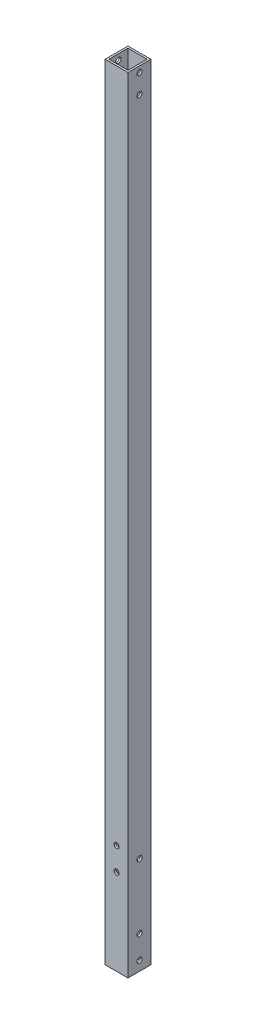
ISO-10303-21;
HEADER;
FILE_DESCRIPTION(('STEP AP214'),'2;1');
FILE_NAME('part.step','',(''),(''),'','','');
FILE_SCHEMA(('AUTOMOTIVE_DESIGN { 1 0 10303 214 1 1 1 1 }'));
ENDSEC;
DATA;
#1=APPLICATION_CONTEXT('core data for automotive mechanical design processes');
#2=APPLICATION_PROTOCOL_DEFINITION('international standard','automotive_design',2000,#1);
#3=PRODUCT_CONTEXT('',#1,'mechanical');
#4=PRODUCT('Part','Part','',(#3));
#5=PRODUCT_RELATED_PRODUCT_CATEGORY('part','',(#4));
#6=PRODUCT_DEFINITION_FORMATION('','',#4);
#7=PRODUCT_DEFINITION_CONTEXT('part definition',#1,'design');
#8=PRODUCT_DEFINITION('design','',#6,#7);
#9=PRODUCT_DEFINITION_SHAPE('','',#8);
#10=(LENGTH_UNIT() NAMED_UNIT(*) SI_UNIT(.MILLI.,.METRE.));
#11=(NAMED_UNIT(*) PLANE_ANGLE_UNIT() SI_UNIT($,.RADIAN.));
#12=(NAMED_UNIT(*) SI_UNIT($,.STERADIAN.) SOLID_ANGLE_UNIT());
#13=UNCERTAINTY_MEASURE_WITH_UNIT(LENGTH_MEASURE(1.E-05),#10,'distance_accuracy_value','');
#14=(GEOMETRIC_REPRESENTATION_CONTEXT(3) GLOBAL_UNCERTAINTY_ASSIGNED_CONTEXT((#13)) GLOBAL_UNIT_ASSIGNED_CONTEXT((#10,
#11,#12)) REPRESENTATION_CONTEXT('',''));
#15=CARTESIAN_POINT('',(0.,0.,0.));
#16=DIRECTION('',(0.,0.,1.));
#17=DIRECTION('',(1.,0.,0.));
#18=AXIS2_PLACEMENT_3D('',#15,#16,#17);
#19=CARTESIAN_POINT('',(0.,410.,0.));
#20=DIRECTION('',(0.,-1.,0.));
#21=DIRECTION('',(0.,0.,-1.));
#22=AXIS2_PLACEMENT_3D('',#19,#20,#21);
#23=PLANE('',#22);
#24=DIRECTION('',(0.,0.,-1.));
#25=VECTOR('',#24,1.);
#26=CARTESIAN_POINT('',(6.,410.,6.));
#27=LINE('',#26,#25);
#28=CARTESIAN_POINT('',(6.,410.,6.));
#29=VERTEX_POINT('',#28);
#30=CARTESIAN_POINT('',(6.,410.,-6.));
#31=VERTEX_POINT('',#30);
#32=EDGE_CURVE('E139',#29,#31,#27,.T.);
#33=ORIENTED_EDGE('',*,*,#32,.T.);
#34=DIRECTION('',(-1.,0.,0.));
#35=VECTOR('',#34,1.);
#36=CARTESIAN_POINT('',(-6.,410.,-6.));
#37=LINE('',#36,#35);
#38=CARTESIAN_POINT('',(-6.,410.,-6.));
#39=VERTEX_POINT('',#38);
#40=EDGE_CURVE('E142',#31,#39,#37,.T.);
#41=ORIENTED_EDGE('',*,*,#40,.T.);
#42=DIRECTION('',(0.,0.,1.));
#43=VECTOR('',#42,1.);
#44=CARTESIAN_POINT('',(-6.,410.,6.));
#45=LINE('',#44,#43);
#46=CARTESIAN_POINT('',(-6.,410.,6.));
#47=VERTEX_POINT('',#46);
#48=EDGE_CURVE('E145',#39,#47,#45,.T.);
#49=ORIENTED_EDGE('',*,*,#48,.T.);
#50=DIRECTION('',(1.,0.,0.));
#51=VECTOR('',#50,1.);
#52=CARTESIAN_POINT('',(-6.,410.,6.));
#53=LINE('',#52,#51);
#54=EDGE_CURVE('E147',#47,#29,#53,.T.);
#55=ORIENTED_EDGE('',*,*,#54,.T.);
#56=EDGE_LOOP('',(#33,#41,#49,#55));
#57=FACE_BOUND('',#56,.T.);
#58=DIRECTION('',(0.,0.,1.));
#59=VECTOR('',#58,1.);
#60=CARTESIAN_POINT('',(-5.,410.,5.));
#61=LINE('',#60,#59);
#62=CARTESIAN_POINT('',(-5.,410.,-5.));
#63=VERTEX_POINT('',#62);
#64=CARTESIAN_POINT('',(-5.,410.,5.));
#65=VERTEX_POINT('',#64);
#66=EDGE_CURVE('E101',#63,#65,#61,.T.);
#67=ORIENTED_EDGE('',*,*,#66,.F.);
#68=DIRECTION('',(-1.,0.,0.));
#69=VECTOR('',#68,1.);
#70=CARTESIAN_POINT('',(-5.,410.,-5.));
#71=LINE('',#70,#69);
#72=CARTESIAN_POINT('',(5.,410.,-5.));
#73=VERTEX_POINT('',#72);
#74=EDGE_CURVE('E123',#73,#63,#71,.T.);
#75=ORIENTED_EDGE('',*,*,#74,.F.);
#76=DIRECTION('',(0.,0.,-1.));
#77=VECTOR('',#76,1.);
#78=CARTESIAN_POINT('',(5.,410.,5.));
#79=LINE('',#78,#77);
#80=CARTESIAN_POINT('',(5.,410.,5.));
#81=VERTEX_POINT('',#80);
#82=EDGE_CURVE('E121',#81,#73,#79,.T.);
#83=ORIENTED_EDGE('',*,*,#82,.F.);
#84=DIRECTION('',(1.,0.,0.));
#85=VECTOR('',#84,1.);
#86=CARTESIAN_POINT('',(-5.,410.,5.));
#87=LINE('',#86,#85);
#88=EDGE_CURVE('E109',#65,#81,#87,.T.);
#89=ORIENTED_EDGE('',*,*,#88,.F.);
#90=EDGE_LOOP('',(#67,#75,#83,#89));
#91=FACE_BOUND('',#90,.T.);
#92=ADVANCED_FACE('F34',(#57,#91),#23,.F.);
#93=CARTESIAN_POINT('',(0.,0.,0.));
#94=DIRECTION('',(0.,-1.,0.));
#95=DIRECTION('',(0.,0.,-1.));
#96=AXIS2_PLACEMENT_3D('',#93,#94,#95);
#97=PLANE('',#96);
#98=DIRECTION('',(0.,0.,-1.));
#99=VECTOR('',#98,1.);
#100=CARTESIAN_POINT('',(6.,0.,6.));
#101=LINE('',#100,#99);
#102=CARTESIAN_POINT('',(6.,0.,6.));
#103=VERTEX_POINT('',#102);
#104=CARTESIAN_POINT('',(6.,0.,-6.));
#105=VERTEX_POINT('',#104);
#106=EDGE_CURVE('E117',#103,#105,#101,.T.);
#107=ORIENTED_EDGE('',*,*,#106,.F.);
#108=DIRECTION('',(1.,0.,0.));
#109=VECTOR('',#108,1.);
#110=CARTESIAN_POINT('',(-6.,0.,6.));
#111=LINE('',#110,#109);
#112=CARTESIAN_POINT('',(-6.,0.,6.));
#113=VERTEX_POINT('',#112);
#114=EDGE_CURVE('E143',#113,#103,#111,.T.);
#115=ORIENTED_EDGE('',*,*,#114,.F.);
#116=DIRECTION('',(0.,0.,1.));
#117=VECTOR('',#116,1.);
#118=CARTESIAN_POINT('',(-6.,0.,6.));
#119=LINE('',#118,#117);
#120=CARTESIAN_POINT('',(-6.,0.,-6.));
#121=VERTEX_POINT('',#120);
#122=EDGE_CURVE('E154',#121,#113,#119,.T.);
#123=ORIENTED_EDGE('',*,*,#122,.F.);
#124=DIRECTION('',(-1.,0.,0.));
#125=VECTOR('',#124,1.);
#126=CARTESIAN_POINT('',(-6.,0.,-6.));
#127=LINE('',#126,#125);
#128=EDGE_CURVE('E152',#105,#121,#127,.T.);
#129=ORIENTED_EDGE('',*,*,#128,.F.);
#130=EDGE_LOOP('',(#107,#115,#123,#129));
#131=FACE_BOUND('',#130,.T.);
#132=DIRECTION('',(-1.,0.,0.));
#133=VECTOR('',#132,1.);
#134=CARTESIAN_POINT('',(-5.,0.,-5.));
#135=LINE('',#134,#133);
#136=CARTESIAN_POINT('',(5.,0.,-5.));
#137=VERTEX_POINT('',#136);
#138=CARTESIAN_POINT('',(-5.,0.,-5.));
#139=VERTEX_POINT('',#138);
#140=EDGE_CURVE('E110',#137,#139,#135,.T.);
#141=ORIENTED_EDGE('',*,*,#140,.T.);
#142=DIRECTION('',(0.,0.,1.));
#143=VECTOR('',#142,1.);
#144=CARTESIAN_POINT('',(-5.,0.,5.));
#145=LINE('',#144,#143);
#146=CARTESIAN_POINT('',(-5.,0.,5.));
#147=VERTEX_POINT('',#146);
#148=EDGE_CURVE('E59',#139,#147,#145,.T.);
#149=ORIENTED_EDGE('',*,*,#148,.T.);
#150=DIRECTION('',(1.,0.,0.));
#151=VECTOR('',#150,1.);
#152=CARTESIAN_POINT('',(-5.,0.,5.));
#153=LINE('',#152,#151);
#154=CARTESIAN_POINT('',(5.,0.,5.));
#155=VERTEX_POINT('',#154);
#156=EDGE_CURVE('E116',#147,#155,#153,.T.);
#157=ORIENTED_EDGE('',*,*,#156,.T.);
#158=DIRECTION('',(0.,0.,-1.));
#159=VECTOR('',#158,1.);
#160=CARTESIAN_POINT('',(5.,0.,5.));
#161=LINE('',#160,#159);
#162=EDGE_CURVE('E131',#155,#137,#161,.T.);
#163=ORIENTED_EDGE('',*,*,#162,.T.);
#164=EDGE_LOOP('',(#141,#149,#157,#163));
#165=FACE_BOUND('',#164,.T.);
#166=ADVANCED_FACE('F284',(#131,#165),#97,.T.);
#167=CARTESIAN_POINT('',(6.,410.,6.));
#168=DIRECTION('',(-1.,0.,0.));
#169=DIRECTION('',(0.,0.,1.));
#170=AXIS2_PLACEMENT_3D('',#167,#168,#169);
#171=PLANE('',#170);
#172=CARTESIAN_POINT('',(6.,407.,0.));
#173=DIRECTION('',(1.,0.,0.));
#174=DIRECTION('',(0.,0.,-1.));
#175=AXIS2_PLACEMENT_3D('',#172,#173,#174);
#176=CIRCLE('',#175,1.34999999999999);
#177=CARTESIAN_POINT('',(6.,407.,-1.34999999999999));
#178=VERTEX_POINT('',#177);
#179=EDGE_CURVE('E212',#178,#178,#176,.T.);
#180=ORIENTED_EDGE('',*,*,#179,.F.);
#181=EDGE_LOOP('',(#180));
#182=FACE_BOUND('',#181,.T.);
#183=CARTESIAN_POINT('',(6.,397.,0.));
#184=DIRECTION('',(1.,0.,0.));
#185=DIRECTION('',(0.,0.,-1.));
#186=AXIS2_PLACEMENT_3D('',#183,#184,#185);
#187=CIRCLE('',#186,1.34999999999999);
#188=CARTESIAN_POINT('',(6.,397.,-1.34999999999999));
#189=VERTEX_POINT('',#188);
#190=EDGE_CURVE('E209',#189,#189,#187,.T.);
#191=ORIENTED_EDGE('',*,*,#190,.F.);
#192=EDGE_LOOP('',(#191));
#193=FACE_BOUND('',#192,.T.);
#194=CARTESIAN_POINT('',(6.,5.,0.));
#195=DIRECTION('',(1.,0.,0.));
#196=DIRECTION('',(0.,0.,-1.));
#197=AXIS2_PLACEMENT_3D('',#194,#195,#196);
#198=CIRCLE('',#197,1.35);
#199=CARTESIAN_POINT('',(6.,5.,-1.35));
#200=VERTEX_POINT('',#199);
#201=EDGE_CURVE('E227',#200,#200,#198,.T.);
#202=ORIENTED_EDGE('',*,*,#201,.F.);
#203=EDGE_LOOP('',(#202));
#204=FACE_BOUND('',#203,.T.);
#205=CARTESIAN_POINT('',(6.,17.,0.));
#206=DIRECTION('',(1.,0.,0.));
#207=DIRECTION('',(0.,0.,-1.));
#208=AXIS2_PLACEMENT_3D('',#205,#206,#207);
#209=CIRCLE('',#208,1.35);
#210=CARTESIAN_POINT('',(6.,17.,-1.35));
#211=VERTEX_POINT('',#210);
#212=EDGE_CURVE('E233',#211,#211,#209,.T.);
#213=ORIENTED_EDGE('',*,*,#212,.F.);
#214=EDGE_LOOP('',(#213));
#215=FACE_BOUND('',#214,.T.);
#216=CARTESIAN_POINT('',(6.,51.,0.));
#217=DIRECTION('',(1.,0.,0.));
#218=DIRECTION('',(0.,0.,-1.));
#219=AXIS2_PLACEMENT_3D('',#216,#217,#218);
#220=CIRCLE('',#219,1.35);
#221=CARTESIAN_POINT('',(6.,51.,-1.35));
#222=VERTEX_POINT('',#221);
#223=EDGE_CURVE('E224',#222,#222,#220,.T.);
#224=ORIENTED_EDGE('',*,*,#223,.F.);
#225=EDGE_LOOP('',(#224));
#226=FACE_BOUND('',#225,.T.);
#227=ORIENTED_EDGE('',*,*,#106,.T.);
#228=DIRECTION('',(0.,-1.,0.));
#229=VECTOR('',#228,1.);
#230=CARTESIAN_POINT('',(6.,410.,-6.));
#231=LINE('',#230,#229);
#232=EDGE_CURVE('E11',#31,#105,#231,.T.);
#233=ORIENTED_EDGE('',*,*,#232,.F.);
#234=ORIENTED_EDGE('',*,*,#32,.F.);
#235=DIRECTION('',(0.,-1.,0.));
#236=VECTOR('',#235,1.);
#237=CARTESIAN_POINT('',(6.,410.,6.));
#238=LINE('',#237,#236);
#239=EDGE_CURVE('E149',#29,#103,#238,.T.);
#240=ORIENTED_EDGE('',*,*,#239,.T.);
#241=EDGE_LOOP('',(#227,#233,#234,#240));
#242=FACE_BOUND('',#241,.T.);
#243=ADVANCED_FACE('F36',(#182,#193,#204,#215,#226,#242),#171,.F.);
#244=CARTESIAN_POINT('',(-6.,410.,-6.));
#245=DIRECTION('',(0.,0.,1.));
#246=DIRECTION('',(1.,0.,0.));
#247=AXIS2_PLACEMENT_3D('',#244,#245,#246);
#248=PLANE('',#247);
#249=CARTESIAN_POINT('',(0.,45.,-6.));
#250=DIRECTION('',(0.,0.,-1.));
#251=DIRECTION('',(-1.,0.,0.));
#252=AXIS2_PLACEMENT_3D('',#249,#250,#251);
#253=CIRCLE('',#252,1.35);
#254=CARTESIAN_POINT('',(-1.35,45.,-6.));
#255=VERTEX_POINT('',#254);
#256=EDGE_CURVE('E193',#255,#255,#253,.T.);
#257=ORIENTED_EDGE('',*,*,#256,.F.);
#258=EDGE_LOOP('',(#257));
#259=FACE_BOUND('',#258,.T.);
#260=CARTESIAN_POINT('',(0.,57.,-6.));
#261=DIRECTION('',(0.,0.,-1.));
#262=DIRECTION('',(-1.,0.,0.));
#263=AXIS2_PLACEMENT_3D('',#260,#261,#262);
#264=CIRCLE('',#263,1.35);
#265=CARTESIAN_POINT('',(-1.35,57.,-6.));
#266=VERTEX_POINT('',#265);
#267=EDGE_CURVE('E203',#266,#266,#264,.T.);
#268=ORIENTED_EDGE('',*,*,#267,.F.);
#269=EDGE_LOOP('',(#268));
#270=FACE_BOUND('',#269,.T.);
#271=ORIENTED_EDGE('',*,*,#128,.T.);
#272=DIRECTION('',(0.,-1.,0.));
#273=VECTOR('',#272,1.);
#274=CARTESIAN_POINT('',(-6.,410.,-6.));
#275=LINE('',#274,#273);
#276=EDGE_CURVE('E43',#39,#121,#275,.T.);
#277=ORIENTED_EDGE('',*,*,#276,.F.);
#278=ORIENTED_EDGE('',*,*,#40,.F.);
#279=ORIENTED_EDGE('',*,*,#232,.T.);
#280=EDGE_LOOP('',(#271,#277,#278,#279));
#281=FACE_BOUND('',#280,.T.);
#282=ADVANCED_FACE('F271',(#259,#270,#281),#248,.F.);
#283=CARTESIAN_POINT('',(-6.,410.,6.));
#284=DIRECTION('',(1.,0.,0.));
#285=DIRECTION('',(0.,0.,-1.));
#286=AXIS2_PLACEMENT_3D('',#283,#284,#285);
#287=PLANE('',#286);
#288=CARTESIAN_POINT('',(-6.,407.,0.));
#289=DIRECTION('',(1.,0.,0.));
#290=DIRECTION('',(0.,0.,-1.));
#291=AXIS2_PLACEMENT_3D('',#288,#289,#290);
#292=CIRCLE('',#291,1.34999999999999);
#293=CARTESIAN_POINT('',(-6.,407.,-1.34999999999999));
#294=VERTEX_POINT('',#293);
#295=EDGE_CURVE('E180',#294,#294,#292,.T.);
#296=ORIENTED_EDGE('',*,*,#295,.T.);
#297=EDGE_LOOP('',(#296));
#298=FACE_BOUND('',#297,.T.);
#299=CARTESIAN_POINT('',(-6.,397.,0.));
#300=DIRECTION('',(1.,0.,0.));
#301=DIRECTION('',(0.,0.,-1.));
#302=AXIS2_PLACEMENT_3D('',#299,#300,#301);
#303=CIRCLE('',#302,1.34999999999999);
#304=CARTESIAN_POINT('',(-6.,397.,-1.34999999999999));
#305=VERTEX_POINT('',#304);
#306=EDGE_CURVE('E215',#305,#305,#303,.T.);
#307=ORIENTED_EDGE('',*,*,#306,.T.);
#308=EDGE_LOOP('',(#307));
#309=FACE_BOUND('',#308,.T.);
#310=CARTESIAN_POINT('',(-6.,5.,0.));
#311=DIRECTION('',(1.,0.,0.));
#312=DIRECTION('',(0.,0.,-1.));
#313=AXIS2_PLACEMENT_3D('',#310,#311,#312);
#314=CIRCLE('',#313,1.35);
#315=CARTESIAN_POINT('',(-6.,5.,-1.35));
#316=VERTEX_POINT('',#315);
#317=EDGE_CURVE('E168',#316,#316,#314,.T.);
#318=ORIENTED_EDGE('',*,*,#317,.T.);
#319=EDGE_LOOP('',(#318));
#320=FACE_BOUND('',#319,.T.);
#321=CARTESIAN_POINT('',(-6.,17.,0.));
#322=DIRECTION('',(1.,0.,0.));
#323=DIRECTION('',(0.,0.,-1.));
#324=AXIS2_PLACEMENT_3D('',#321,#322,#323);
#325=CIRCLE('',#324,1.35);
#326=CARTESIAN_POINT('',(-6.,17.,-1.35));
#327=VERTEX_POINT('',#326);
#328=EDGE_CURVE('E230',#327,#327,#325,.T.);
#329=ORIENTED_EDGE('',*,*,#328,.T.);
#330=EDGE_LOOP('',(#329));
#331=FACE_BOUND('',#330,.T.);
#332=CARTESIAN_POINT('',(-6.,51.,0.));
#333=DIRECTION('',(1.,0.,0.));
#334=DIRECTION('',(0.,0.,-1.));
#335=AXIS2_PLACEMENT_3D('',#332,#333,#334);
#336=CIRCLE('',#335,1.35);
#337=CARTESIAN_POINT('',(-6.,51.,-1.35));
#338=VERTEX_POINT('',#337);
#339=EDGE_CURVE('E236',#338,#338,#336,.T.);
#340=ORIENTED_EDGE('',*,*,#339,.T.);
#341=EDGE_LOOP('',(#340));
#342=FACE_BOUND('',#341,.T.);
#343=ORIENTED_EDGE('',*,*,#122,.T.);
#344=DIRECTION('',(0.,-1.,0.));
#345=VECTOR('',#344,1.);
#346=CARTESIAN_POINT('',(-6.,410.,6.));
#347=LINE('',#346,#345);
#348=EDGE_CURVE('E159',#47,#113,#347,.T.);
#349=ORIENTED_EDGE('',*,*,#348,.F.);
#350=ORIENTED_EDGE('',*,*,#48,.F.);
#351=ORIENTED_EDGE('',*,*,#276,.T.);
#352=EDGE_LOOP('',(#343,#349,#350,#351));
#353=FACE_BOUND('',#352,.T.);
#354=ADVANCED_FACE('F268',(#298,#309,#320,#331,#342,#353),#287,.F.);
#355=CARTESIAN_POINT('',(-6.,410.,6.));
#356=DIRECTION('',(0.,0.,-1.));
#357=DIRECTION('',(-1.,0.,0.));
#358=AXIS2_PLACEMENT_3D('',#355,#356,#357);
#359=PLANE('',#358);
#360=CARTESIAN_POINT('',(0.,45.,6.));
#361=DIRECTION('',(0.,0.,-1.));
#362=DIRECTION('',(-1.,0.,0.));
#363=AXIS2_PLACEMENT_3D('',#360,#361,#362);
#364=CIRCLE('',#363,1.35);
#365=CARTESIAN_POINT('',(-1.35,45.,6.));
#366=VERTEX_POINT('',#365);
#367=EDGE_CURVE('E187',#366,#366,#364,.T.);
#368=ORIENTED_EDGE('',*,*,#367,.T.);
#369=EDGE_LOOP('',(#368));
#370=FACE_BOUND('',#369,.T.);
#371=CARTESIAN_POINT('',(0.,57.,6.));
#372=DIRECTION('',(0.,0.,-1.));
#373=DIRECTION('',(-1.,0.,0.));
#374=AXIS2_PLACEMENT_3D('',#371,#372,#373);
#375=CIRCLE('',#374,1.35);
#376=CARTESIAN_POINT('',(-1.35,57.,6.));
#377=VERTEX_POINT('',#376);
#378=EDGE_CURVE('E198',#377,#377,#375,.T.);
#379=ORIENTED_EDGE('',*,*,#378,.T.);
#380=EDGE_LOOP('',(#379));
#381=FACE_BOUND('',#380,.T.);
#382=ORIENTED_EDGE('',*,*,#114,.T.);
#383=ORIENTED_EDGE('',*,*,#239,.F.);
#384=ORIENTED_EDGE('',*,*,#54,.F.);
#385=ORIENTED_EDGE('',*,*,#348,.T.);
#386=EDGE_LOOP('',(#382,#383,#384,#385));
#387=FACE_BOUND('',#386,.T.);
#388=ADVANCED_FACE('F252',(#370,#381,#387),#359,.F.);
#389=CARTESIAN_POINT('',(-5.,410.,5.));
#390=DIRECTION('',(1.,0.,0.));
#391=DIRECTION('',(0.,0.,-1.));
#392=AXIS2_PLACEMENT_3D('',#389,#390,#391);
#393=PLANE('',#392);
#394=CARTESIAN_POINT('',(-5.,407.,0.));
#395=DIRECTION('',(1.,0.,0.));
#396=DIRECTION('',(0.,0.,-1.));
#397=AXIS2_PLACEMENT_3D('',#394,#395,#396);
#398=CIRCLE('',#397,1.34999999999999);
#399=CARTESIAN_POINT('',(-5.,407.,-1.34999999999999));
#400=VERTEX_POINT('',#399);
#401=EDGE_CURVE('E183',#400,#400,#398,.T.);
#402=ORIENTED_EDGE('',*,*,#401,.F.);
#403=EDGE_LOOP('',(#402));
#404=FACE_BOUND('',#403,.T.);
#405=CARTESIAN_POINT('',(-5.,397.,0.));
#406=DIRECTION('',(1.,0.,0.));
#407=DIRECTION('',(0.,0.,-1.));
#408=AXIS2_PLACEMENT_3D('',#405,#406,#407);
#409=CIRCLE('',#408,1.34999999999999);
#410=CARTESIAN_POINT('',(-5.,397.,-1.34999999999999));
#411=VERTEX_POINT('',#410);
#412=EDGE_CURVE('E179',#411,#411,#409,.T.);
#413=ORIENTED_EDGE('',*,*,#412,.F.);
#414=EDGE_LOOP('',(#413));
#415=FACE_BOUND('',#414,.T.);
#416=CARTESIAN_POINT('',(-5.,5.,0.));
#417=DIRECTION('',(1.,0.,0.));
#418=DIRECTION('',(0.,0.,-1.));
#419=AXIS2_PLACEMENT_3D('',#416,#417,#418);
#420=CIRCLE('',#419,1.35);
#421=CARTESIAN_POINT('',(-5.,5.,-1.35));
#422=VERTEX_POINT('',#421);
#423=EDGE_CURVE('E129',#422,#422,#420,.T.);
#424=ORIENTED_EDGE('',*,*,#423,.F.);
#425=EDGE_LOOP('',(#424));
#426=FACE_BOUND('',#425,.T.);
#427=CARTESIAN_POINT('',(-5.,17.,0.));
#428=DIRECTION('',(1.,0.,0.));
#429=DIRECTION('',(0.,0.,-1.));
#430=AXIS2_PLACEMENT_3D('',#427,#428,#429);
#431=CIRCLE('',#430,1.35);
#432=CARTESIAN_POINT('',(-5.,17.,-1.35));
#433=VERTEX_POINT('',#432);
#434=EDGE_CURVE('E172',#433,#433,#431,.T.);
#435=ORIENTED_EDGE('',*,*,#434,.F.);
#436=EDGE_LOOP('',(#435));
#437=FACE_BOUND('',#436,.T.);
#438=CARTESIAN_POINT('',(-5.,51.,0.));
#439=DIRECTION('',(1.,0.,0.));
#440=DIRECTION('',(0.,0.,-1.));
#441=AXIS2_PLACEMENT_3D('',#438,#439,#440);
#442=CIRCLE('',#441,1.35);
#443=CARTESIAN_POINT('',(-5.,51.,-1.35));
#444=VERTEX_POINT('',#443);
#445=EDGE_CURVE('E167',#444,#444,#442,.T.);
#446=ORIENTED_EDGE('',*,*,#445,.F.);
#447=EDGE_LOOP('',(#446));
#448=FACE_BOUND('',#447,.T.);
#449=ORIENTED_EDGE('',*,*,#148,.F.);
#450=DIRECTION('',(0.,-1.,0.));
#451=VECTOR('',#450,1.);
#452=CARTESIAN_POINT('',(-5.,410.,-5.));
#453=LINE('',#452,#451);
#454=EDGE_CURVE('E105',#63,#139,#453,.T.);
#455=ORIENTED_EDGE('',*,*,#454,.F.);
#456=ORIENTED_EDGE('',*,*,#66,.T.);
#457=DIRECTION('',(0.,-1.,0.));
#458=VECTOR('',#457,1.);
#459=CARTESIAN_POINT('',(-5.,410.,5.));
#460=LINE('',#459,#458);
#461=EDGE_CURVE('E104',#65,#147,#460,.T.);
#462=ORIENTED_EDGE('',*,*,#461,.T.);
#463=EDGE_LOOP('',(#449,#455,#456,#462));
#464=FACE_BOUND('',#463,.T.);
#465=ADVANCED_FACE('F103',(#404,#415,#426,#437,#448,#464),#393,.T.);
#466=CARTESIAN_POINT('',(-5.,410.,5.));
#467=DIRECTION('',(0.,0.,-1.));
#468=DIRECTION('',(-1.,0.,0.));
#469=AXIS2_PLACEMENT_3D('',#466,#467,#468);
#470=PLANE('',#469);
#471=CARTESIAN_POINT('',(0.,45.,5.));
#472=DIRECTION('',(0.,0.,-1.));
#473=DIRECTION('',(-1.,0.,0.));
#474=AXIS2_PLACEMENT_3D('',#471,#472,#473);
#475=CIRCLE('',#474,1.35);
#476=CARTESIAN_POINT('',(-1.35,45.,5.));
#477=VERTEX_POINT('',#476);
#478=EDGE_CURVE('E206',#477,#477,#475,.T.);
#479=ORIENTED_EDGE('',*,*,#478,.F.);
#480=EDGE_LOOP('',(#479));
#481=FACE_BOUND('',#480,.T.);
#482=CARTESIAN_POINT('',(0.,57.,5.));
#483=DIRECTION('',(0.,0.,-1.));
#484=DIRECTION('',(-1.,0.,0.));
#485=AXIS2_PLACEMENT_3D('',#482,#483,#484);
#486=CIRCLE('',#485,1.35);
#487=CARTESIAN_POINT('',(-1.35,57.,5.));
#488=VERTEX_POINT('',#487);
#489=EDGE_CURVE('E186',#488,#488,#486,.T.);
#490=ORIENTED_EDGE('',*,*,#489,.F.);
#491=EDGE_LOOP('',(#490));
#492=FACE_BOUND('',#491,.T.);
#493=ORIENTED_EDGE('',*,*,#156,.F.);
#494=ORIENTED_EDGE('',*,*,#461,.F.);
#495=ORIENTED_EDGE('',*,*,#88,.T.);
#496=DIRECTION('',(0.,-1.,0.));
#497=VECTOR('',#496,1.);
#498=CARTESIAN_POINT('',(5.,410.,5.));
#499=LINE('',#498,#497);
#500=EDGE_CURVE('E118',#81,#155,#499,.T.);
#501=ORIENTED_EDGE('',*,*,#500,.T.);
#502=EDGE_LOOP('',(#493,#494,#495,#501));
#503=FACE_BOUND('',#502,.T.);
#504=ADVANCED_FACE('F113',(#481,#492,#503),#470,.T.);
#505=CARTESIAN_POINT('',(5.,410.,5.));
#506=DIRECTION('',(-1.,0.,0.));
#507=DIRECTION('',(0.,0.,1.));
#508=AXIS2_PLACEMENT_3D('',#505,#506,#507);
#509=PLANE('',#508);
#510=CARTESIAN_POINT('',(5.,407.,0.));
#511=DIRECTION('',(-1.,0.,0.));
#512=DIRECTION('',(0.,0.,1.));
#513=AXIS2_PLACEMENT_3D('',#510,#511,#512);
#514=CIRCLE('',#513,1.34999999999999);
#515=CARTESIAN_POINT('',(5.,407.,1.34999999999999));
#516=VERTEX_POINT('',#515);
#517=EDGE_CURVE('E181',#516,#516,#514,.T.);
#518=ORIENTED_EDGE('',*,*,#517,.F.);
#519=EDGE_LOOP('',(#518));
#520=FACE_BOUND('',#519,.T.);
#521=CARTESIAN_POINT('',(5.,397.,0.));
#522=DIRECTION('',(-1.,0.,0.));
#523=DIRECTION('',(0.,0.,1.));
#524=AXIS2_PLACEMENT_3D('',#521,#522,#523);
#525=CIRCLE('',#524,1.34999999999999);
#526=CARTESIAN_POINT('',(5.,397.,1.34999999999999));
#527=VERTEX_POINT('',#526);
#528=EDGE_CURVE('E176',#527,#527,#525,.T.);
#529=ORIENTED_EDGE('',*,*,#528,.F.);
#530=EDGE_LOOP('',(#529));
#531=FACE_BOUND('',#530,.T.);
#532=CARTESIAN_POINT('',(5.,5.,0.));
#533=DIRECTION('',(-1.,0.,0.));
#534=DIRECTION('',(0.,0.,1.));
#535=AXIS2_PLACEMENT_3D('',#532,#533,#534);
#536=CIRCLE('',#535,1.35);
#537=CARTESIAN_POINT('',(5.,5.,1.35));
#538=VERTEX_POINT('',#537);
#539=EDGE_CURVE('E173',#538,#538,#536,.T.);
#540=ORIENTED_EDGE('',*,*,#539,.F.);
#541=EDGE_LOOP('',(#540));
#542=FACE_BOUND('',#541,.T.);
#543=CARTESIAN_POINT('',(5.,17.,0.));
#544=DIRECTION('',(-1.,0.,0.));
#545=DIRECTION('',(0.,0.,1.));
#546=AXIS2_PLACEMENT_3D('',#543,#544,#545);
#547=CIRCLE('',#546,1.35);
#548=CARTESIAN_POINT('',(5.,17.,1.35));
#549=VERTEX_POINT('',#548);
#550=EDGE_CURVE('E169',#549,#549,#547,.T.);
#551=ORIENTED_EDGE('',*,*,#550,.F.);
#552=EDGE_LOOP('',(#551));
#553=FACE_BOUND('',#552,.T.);
#554=CARTESIAN_POINT('',(5.,51.,0.));
#555=DIRECTION('',(-1.,0.,0.));
#556=DIRECTION('',(0.,0.,1.));
#557=AXIS2_PLACEMENT_3D('',#554,#555,#556);
#558=CIRCLE('',#557,1.35);
#559=CARTESIAN_POINT('',(5.,51.,1.35));
#560=VERTEX_POINT('',#559);
#561=EDGE_CURVE('E164',#560,#560,#558,.T.);
#562=ORIENTED_EDGE('',*,*,#561,.F.);
#563=EDGE_LOOP('',(#562));
#564=FACE_BOUND('',#563,.T.);
#565=ORIENTED_EDGE('',*,*,#162,.F.);
#566=ORIENTED_EDGE('',*,*,#500,.F.);
#567=ORIENTED_EDGE('',*,*,#82,.T.);
#568=DIRECTION('',(0.,-1.,0.));
#569=VECTOR('',#568,1.);
#570=CARTESIAN_POINT('',(5.,410.,-5.));
#571=LINE('',#570,#569);
#572=EDGE_CURVE('E51',#73,#137,#571,.T.);
#573=ORIENTED_EDGE('',*,*,#572,.T.);
#574=EDGE_LOOP('',(#565,#566,#567,#573));
#575=FACE_BOUND('',#574,.T.);
#576=ADVANCED_FACE('F373',(#520,#531,#542,#553,#564,#575),#509,.T.);
#577=CARTESIAN_POINT('',(-5.,410.,-5.));
#578=DIRECTION('',(0.,0.,1.));
#579=DIRECTION('',(1.,0.,0.));
#580=AXIS2_PLACEMENT_3D('',#577,#578,#579);
#581=PLANE('',#580);
#582=CARTESIAN_POINT('',(0.,45.,-5.));
#583=DIRECTION('',(0.,0.,1.));
#584=DIRECTION('',(1.,0.,0.));
#585=AXIS2_PLACEMENT_3D('',#582,#583,#584);
#586=CIRCLE('',#585,1.35);
#587=CARTESIAN_POINT('',(1.35,45.,-5.));
#588=VERTEX_POINT('',#587);
#589=EDGE_CURVE('E38',#588,#588,#586,.T.);
#590=ORIENTED_EDGE('',*,*,#589,.F.);
#591=EDGE_LOOP('',(#590));
#592=FACE_BOUND('',#591,.T.);
#593=CARTESIAN_POINT('',(0.,57.,-5.));
#594=DIRECTION('',(0.,0.,1.));
#595=DIRECTION('',(1.,0.,0.));
#596=AXIS2_PLACEMENT_3D('',#593,#594,#595);
#597=CIRCLE('',#596,1.35);
#598=CARTESIAN_POINT('',(1.35,57.,-5.));
#599=VERTEX_POINT('',#598);
#600=EDGE_CURVE('E184',#599,#599,#597,.T.);
#601=ORIENTED_EDGE('',*,*,#600,.F.);
#602=EDGE_LOOP('',(#601));
#603=FACE_BOUND('',#602,.T.);
#604=ORIENTED_EDGE('',*,*,#140,.F.);
#605=ORIENTED_EDGE('',*,*,#572,.F.);
#606=ORIENTED_EDGE('',*,*,#74,.T.);
#607=ORIENTED_EDGE('',*,*,#454,.T.);
#608=EDGE_LOOP('',(#604,#605,#606,#607));
#609=FACE_BOUND('',#608,.T.);
#610=ADVANCED_FACE('F365',(#592,#603,#609),#581,.T.);
#611=CARTESIAN_POINT('',(-6.,51.,0.));
#612=DIRECTION('',(1.,0.,0.));
#613=DIRECTION('',(0.,0.,-1.));
#614=AXIS2_PLACEMENT_3D('',#611,#612,#613);
#615=CYLINDRICAL_SURFACE('',#614,1.35);
#616=ORIENTED_EDGE('',*,*,#561,.T.);
#617=EDGE_LOOP('',(#616));
#618=FACE_BOUND('',#617,.T.);
#619=ORIENTED_EDGE('',*,*,#223,.T.);
#620=EDGE_LOOP('',(#619));
#621=FACE_BOUND('',#620,.T.);
#622=ADVANCED_FACE('F265',(#618,#621),#615,.F.);
#623=CARTESIAN_POINT('',(-6.,17.,0.));
#624=DIRECTION('',(1.,0.,0.));
#625=DIRECTION('',(0.,0.,-1.));
#626=AXIS2_PLACEMENT_3D('',#623,#624,#625);
#627=CYLINDRICAL_SURFACE('',#626,1.35);
#628=ORIENTED_EDGE('',*,*,#550,.T.);
#629=EDGE_LOOP('',(#628));
#630=FACE_BOUND('',#629,.T.);
#631=ORIENTED_EDGE('',*,*,#212,.T.);
#632=EDGE_LOOP('',(#631));
#633=FACE_BOUND('',#632,.T.);
#634=ADVANCED_FACE('F364',(#630,#633),#627,.F.);
#635=CARTESIAN_POINT('',(-6.,5.,0.));
#636=DIRECTION('',(1.,0.,0.));
#637=DIRECTION('',(0.,0.,-1.));
#638=AXIS2_PLACEMENT_3D('',#635,#636,#637);
#639=CYLINDRICAL_SURFACE('',#638,1.35);
#640=ORIENTED_EDGE('',*,*,#539,.T.);
#641=EDGE_LOOP('',(#640));
#642=FACE_BOUND('',#641,.T.);
#643=ORIENTED_EDGE('',*,*,#201,.T.);
#644=EDGE_LOOP('',(#643));
#645=FACE_BOUND('',#644,.T.);
#646=ADVANCED_FACE('F263',(#642,#645),#639,.F.);
#647=ORIENTED_EDGE('',*,*,#445,.T.);
#648=EDGE_LOOP('',(#647));
#649=FACE_BOUND('',#648,.T.);
#650=ORIENTED_EDGE('',*,*,#339,.F.);
#651=EDGE_LOOP('',(#650));
#652=FACE_BOUND('',#651,.T.);
#653=ADVANCED_FACE('F259',(#649,#652),#615,.F.);
#654=ORIENTED_EDGE('',*,*,#434,.T.);
#655=EDGE_LOOP('',(#654));
#656=FACE_BOUND('',#655,.T.);
#657=ORIENTED_EDGE('',*,*,#328,.F.);
#658=EDGE_LOOP('',(#657));
#659=FACE_BOUND('',#658,.T.);
#660=ADVANCED_FACE('F262',(#656,#659),#627,.F.);
#661=ORIENTED_EDGE('',*,*,#423,.T.);
#662=EDGE_LOOP('',(#661));
#663=FACE_BOUND('',#662,.T.);
#664=ORIENTED_EDGE('',*,*,#317,.F.);
#665=EDGE_LOOP('',(#664));
#666=FACE_BOUND('',#665,.T.);
#667=ADVANCED_FACE('F247',(#663,#666),#639,.F.);
#668=CARTESIAN_POINT('',(-6.,397.,0.));
#669=DIRECTION('',(1.,0.,0.));
#670=DIRECTION('',(0.,0.,-1.));
#671=AXIS2_PLACEMENT_3D('',#668,#669,#670);
#672=CYLINDRICAL_SURFACE('',#671,1.34999999999999);
#673=ORIENTED_EDGE('',*,*,#528,.T.);
#674=EDGE_LOOP('',(#673));
#675=FACE_BOUND('',#674,.T.);
#676=ORIENTED_EDGE('',*,*,#190,.T.);
#677=EDGE_LOOP('',(#676));
#678=FACE_BOUND('',#677,.T.);
#679=ADVANCED_FACE('F343',(#675,#678),#672,.F.);
#680=CARTESIAN_POINT('',(-6.,407.,0.));
#681=DIRECTION('',(1.,0.,0.));
#682=DIRECTION('',(0.,0.,-1.));
#683=AXIS2_PLACEMENT_3D('',#680,#681,#682);
#684=CYLINDRICAL_SURFACE('',#683,1.34999999999999);
#685=ORIENTED_EDGE('',*,*,#517,.T.);
#686=EDGE_LOOP('',(#685));
#687=FACE_BOUND('',#686,.T.);
#688=ORIENTED_EDGE('',*,*,#179,.T.);
#689=EDGE_LOOP('',(#688));
#690=FACE_BOUND('',#689,.T.);
#691=ADVANCED_FACE('F335',(#687,#690),#684,.F.);
#692=ORIENTED_EDGE('',*,*,#412,.T.);
#693=EDGE_LOOP('',(#692));
#694=FACE_BOUND('',#693,.T.);
#695=ORIENTED_EDGE('',*,*,#306,.F.);
#696=EDGE_LOOP('',(#695));
#697=FACE_BOUND('',#696,.T.);
#698=ADVANCED_FACE('F333',(#694,#697),#672,.F.);
#699=ORIENTED_EDGE('',*,*,#401,.T.);
#700=EDGE_LOOP('',(#699));
#701=FACE_BOUND('',#700,.T.);
#702=ORIENTED_EDGE('',*,*,#295,.F.);
#703=EDGE_LOOP('',(#702));
#704=FACE_BOUND('',#703,.T.);
#705=ADVANCED_FACE('F329',(#701,#704),#684,.F.);
#706=CARTESIAN_POINT('',(0.,57.,6.));
#707=DIRECTION('',(0.,0.,-1.));
#708=DIRECTION('',(-1.,0.,0.));
#709=AXIS2_PLACEMENT_3D('',#706,#707,#708);
#710=CYLINDRICAL_SURFACE('',#709,1.35);
#711=ORIENTED_EDGE('',*,*,#600,.T.);
#712=EDGE_LOOP('',(#711));
#713=FACE_BOUND('',#712,.T.);
#714=ORIENTED_EDGE('',*,*,#267,.T.);
#715=EDGE_LOOP('',(#714));
#716=FACE_BOUND('',#715,.T.);
#717=ADVANCED_FACE('F319',(#713,#716),#710,.F.);
#718=CARTESIAN_POINT('',(0.,45.,6.));
#719=DIRECTION('',(0.,0.,-1.));
#720=DIRECTION('',(-1.,0.,0.));
#721=AXIS2_PLACEMENT_3D('',#718,#719,#720);
#722=CYLINDRICAL_SURFACE('',#721,1.35);
#723=ORIENTED_EDGE('',*,*,#589,.T.);
#724=EDGE_LOOP('',(#723));
#725=FACE_BOUND('',#724,.T.);
#726=ORIENTED_EDGE('',*,*,#256,.T.);
#727=EDGE_LOOP('',(#726));
#728=FACE_BOUND('',#727,.T.);
#729=ADVANCED_FACE('F316',(#725,#728),#722,.F.);
#730=ORIENTED_EDGE('',*,*,#489,.T.);
#731=EDGE_LOOP('',(#730));
#732=FACE_BOUND('',#731,.T.);
#733=ORIENTED_EDGE('',*,*,#378,.F.);
#734=EDGE_LOOP('',(#733));
#735=FACE_BOUND('',#734,.T.);
#736=ADVANCED_FACE('F313',(#732,#735),#710,.F.);
#737=ORIENTED_EDGE('',*,*,#478,.T.);
#738=EDGE_LOOP('',(#737));
#739=FACE_BOUND('',#738,.T.);
#740=ORIENTED_EDGE('',*,*,#367,.F.);
#741=EDGE_LOOP('',(#740));
#742=FACE_BOUND('',#741,.T.);
#743=ADVANCED_FACE('F315',(#739,#742),#722,.F.);
#744=CLOSED_SHELL('',(#92,#166,#243,#282,#354,#388,#465,#504,#576,#610,#622,#634,#646,#653,#660,
#667,#679,#691,#698,#705,#717,#729,#736,#743));
#745=MANIFOLD_SOLID_BREP('B2',#744);
#746=ADVANCED_BREP_SHAPE_REPRESENTATION('',(#18,#745),#14);
#747=SHAPE_DEFINITION_REPRESENTATION(#9,#746);
ENDSEC;
END-ISO-10303-21;
